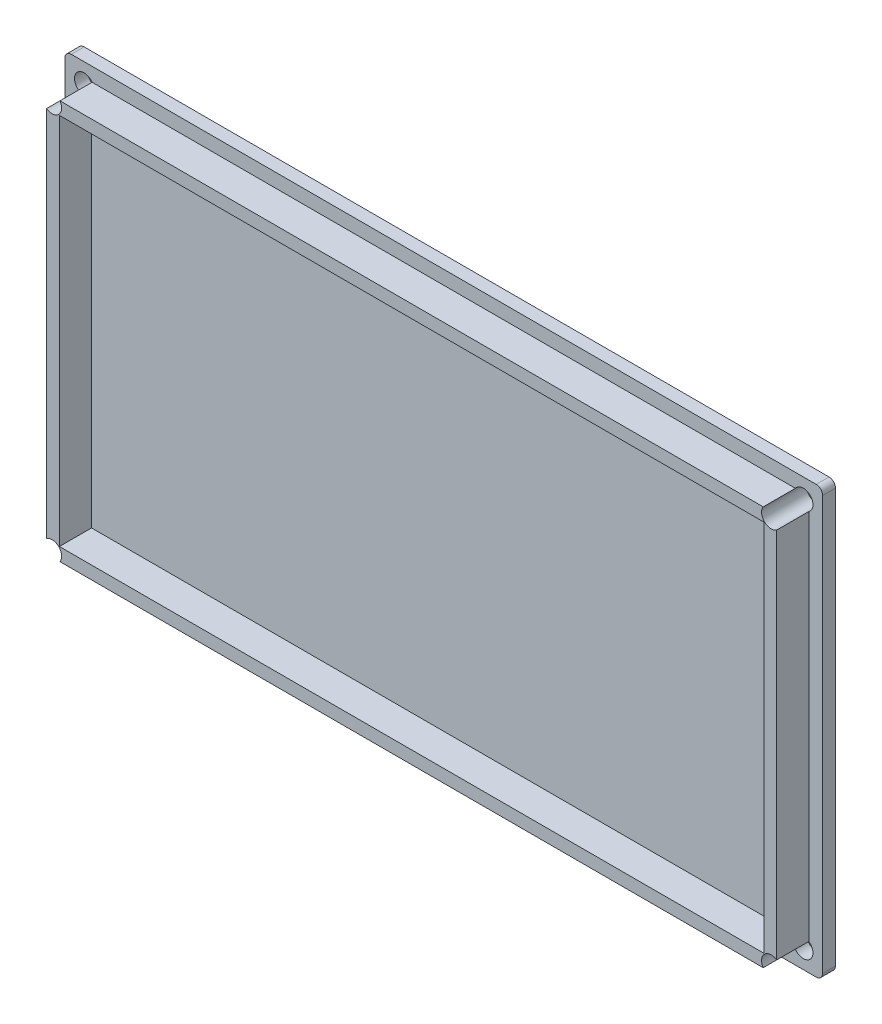
ISO-10303-21;
HEADER;
FILE_DESCRIPTION(('STEP AP214'),'2;1');
FILE_NAME('part.step','',(''),(''),'','','');
FILE_SCHEMA(('AUTOMOTIVE_DESIGN { 1 0 10303 214 1 1 1 1 }'));
ENDSEC;
DATA;
#1=APPLICATION_CONTEXT('core data for automotive mechanical design processes');
#2=APPLICATION_PROTOCOL_DEFINITION('international standard','automotive_design',2000,#1);
#3=PRODUCT_CONTEXT('',#1,'mechanical');
#4=PRODUCT('Part','Part','',(#3));
#5=PRODUCT_RELATED_PRODUCT_CATEGORY('part','',(#4));
#6=PRODUCT_DEFINITION_FORMATION('','',#4);
#7=PRODUCT_DEFINITION_CONTEXT('part definition',#1,'design');
#8=PRODUCT_DEFINITION('design','',#6,#7);
#9=PRODUCT_DEFINITION_SHAPE('','',#8);
#10=(LENGTH_UNIT() NAMED_UNIT(*) SI_UNIT(.MILLI.,.METRE.));
#11=(NAMED_UNIT(*) PLANE_ANGLE_UNIT() SI_UNIT($,.RADIAN.));
#12=(NAMED_UNIT(*) SI_UNIT($,.STERADIAN.) SOLID_ANGLE_UNIT());
#13=UNCERTAINTY_MEASURE_WITH_UNIT(LENGTH_MEASURE(1.E-05),#10,'distance_accuracy_value','');
#14=(GEOMETRIC_REPRESENTATION_CONTEXT(3) GLOBAL_UNCERTAINTY_ASSIGNED_CONTEXT((#13)) GLOBAL_UNIT_ASSIGNED_CONTEXT((#10,
#11,#12)) REPRESENTATION_CONTEXT('',''));
#15=CARTESIAN_POINT('',(0.,0.,0.));
#16=DIRECTION('',(0.,0.,1.));
#17=DIRECTION('',(1.,0.,0.));
#18=AXIS2_PLACEMENT_3D('',#15,#16,#17);
#19=CARTESIAN_POINT('',(60.052066251637,31.05,7.));
#20=DIRECTION('',(0.,-1.,0.));
#21=DIRECTION('',(0.,0.,-1.));
#22=AXIS2_PLACEMENT_3D('',#19,#20,#21);
#23=PLANE('',#22);
#24=DIRECTION('',(0.,0.,-1.));
#25=VECTOR('',#24,1.);
#26=CARTESIAN_POINT('',(-51.4620130389321,31.05,7.));
#27=LINE('',#26,#25);
#28=CARTESIAN_POINT('',(-51.4620130389321,31.05,7.));
#29=VERTEX_POINT('',#28);
#30=CARTESIAN_POINT('',(-51.4620130389321,31.05,2.));
#31=VERTEX_POINT('',#30);
#32=EDGE_CURVE('E416',#29,#31,#27,.T.);
#33=ORIENTED_EDGE('',*,*,#32,.F.);
#34=DIRECTION('',(-1.,0.,0.));
#35=VECTOR('',#34,1.);
#36=CARTESIAN_POINT('',(60.052066251637,31.05,7.));
#37=LINE('',#36,#35);
#38=CARTESIAN_POINT('',(57.9661455422062,31.05,7.));
#39=VERTEX_POINT('',#38);
#40=EDGE_CURVE('E214',#39,#29,#37,.T.);
#41=ORIENTED_EDGE('',*,*,#40,.F.);
#42=DIRECTION('',(0.,0.,-1.));
#43=VECTOR('',#42,1.);
#44=CARTESIAN_POINT('',(57.9661455422062,31.05,7.));
#45=LINE('',#44,#43);
#46=CARTESIAN_POINT('',(57.9661455422062,31.05,2.));
#47=VERTEX_POINT('',#46);
#48=EDGE_CURVE('E253',#39,#47,#45,.T.);
#49=ORIENTED_EDGE('',*,*,#48,.T.);
#50=DIRECTION('',(-1.,0.,0.));
#51=VECTOR('',#50,1.);
#52=CARTESIAN_POINT('',(60.052066251637,31.05,2.));
#53=LINE('',#52,#51);
#54=EDGE_CURVE('E232',#47,#31,#53,.T.);
#55=ORIENTED_EDGE('',*,*,#54,.T.);
#56=EDGE_LOOP('',(#33,#41,#49,#55));
#57=FACE_BOUND('',#56,.T.);
#58=ADVANCED_FACE('F45',(#57),#23,.F.);
#59=CARTESIAN_POINT('',(-53.547933748363,31.05,7.));
#60=DIRECTION('',(1.,0.,0.));
#61=DIRECTION('',(0.,0.,-1.));
#62=AXIS2_PLACEMENT_3D('',#59,#60,#61);
#63=PLANE('',#62);
#64=DIRECTION('',(0.,-1.,0.));
#65=VECTOR('',#64,1.);
#66=CARTESIAN_POINT('',(-53.547933748363,31.05,2.));
#67=LINE('',#66,#65);
#68=CARTESIAN_POINT('',(-53.547933748363,28.9640792905692,2.));
#69=VERTEX_POINT('',#68);
#70=CARTESIAN_POINT('',(-53.547933748363,-28.9640792905692,2.));
#71=VERTEX_POINT('',#70);
#72=EDGE_CURVE('E204',#69,#71,#67,.T.);
#73=ORIENTED_EDGE('',*,*,#72,.T.);
#74=DIRECTION('',(0.,0.,-1.));
#75=VECTOR('',#74,1.);
#76=CARTESIAN_POINT('',(-53.547933748363,-28.9640792905692,7.));
#77=LINE('',#76,#75);
#78=CARTESIAN_POINT('',(-53.547933748363,-28.9640792905692,7.));
#79=VERTEX_POINT('',#78);
#80=EDGE_CURVE('E186',#71,#79,#77,.F.);
#81=ORIENTED_EDGE('',*,*,#80,.T.);
#82=DIRECTION('',(0.,-1.,0.));
#83=VECTOR('',#82,1.);
#84=CARTESIAN_POINT('',(-53.547933748363,31.05,7.));
#85=LINE('',#84,#83);
#86=CARTESIAN_POINT('',(-53.547933748363,28.9640792905692,7.));
#87=VERTEX_POINT('',#86);
#88=EDGE_CURVE('E202',#87,#79,#85,.T.);
#89=ORIENTED_EDGE('',*,*,#88,.F.);
#90=DIRECTION('',(0.,0.,-1.));
#91=VECTOR('',#90,1.);
#92=CARTESIAN_POINT('',(-53.547933748363,28.9640792905692,7.));
#93=LINE('',#92,#91);
#94=EDGE_CURVE('E195',#69,#87,#93,.F.);
#95=ORIENTED_EDGE('',*,*,#94,.F.);
#96=EDGE_LOOP('',(#73,#81,#89,#95));
#97=FACE_BOUND('',#96,.T.);
#98=ADVANCED_FACE('F200',(#97),#63,.F.);
#99=CARTESIAN_POINT('',(-53.547933748363,-31.05,7.));
#100=DIRECTION('',(0.,1.,0.));
#101=DIRECTION('',(0.,0.,1.));
#102=AXIS2_PLACEMENT_3D('',#99,#100,#101);
#103=PLANE('',#102);
#104=DIRECTION('',(1.,0.,0.));
#105=VECTOR('',#104,1.);
#106=CARTESIAN_POINT('',(-53.547933748363,-31.05,7.));
#107=LINE('',#106,#105);
#108=CARTESIAN_POINT('',(-51.4620130389321,-31.05,7.));
#109=VERTEX_POINT('',#108);
#110=CARTESIAN_POINT('',(57.9661455422062,-31.05,7.));
#111=VERTEX_POINT('',#110);
#112=EDGE_CURVE('E238',#109,#111,#107,.T.);
#113=ORIENTED_EDGE('',*,*,#112,.F.);
#114=DIRECTION('',(0.,0.,-1.));
#115=VECTOR('',#114,1.);
#116=CARTESIAN_POINT('',(-51.4620130389321,-31.05,7.));
#117=LINE('',#116,#115);
#118=CARTESIAN_POINT('',(-51.4620130389321,-31.05,2.));
#119=VERTEX_POINT('',#118);
#120=EDGE_CURVE('E189',#109,#119,#117,.T.);
#121=ORIENTED_EDGE('',*,*,#120,.T.);
#122=DIRECTION('',(1.,0.,0.));
#123=VECTOR('',#122,1.);
#124=CARTESIAN_POINT('',(-53.547933748363,-31.05,2.));
#125=LINE('',#124,#123);
#126=CARTESIAN_POINT('',(57.9661455422062,-31.05,2.));
#127=VERTEX_POINT('',#126);
#128=EDGE_CURVE('E225',#119,#127,#125,.T.);
#129=ORIENTED_EDGE('',*,*,#128,.T.);
#130=DIRECTION('',(0.,0.,-1.));
#131=VECTOR('',#130,1.);
#132=CARTESIAN_POINT('',(57.9661455422062,-31.05,7.));
#133=LINE('',#132,#131);
#134=EDGE_CURVE('E430',#111,#127,#133,.T.);
#135=ORIENTED_EDGE('',*,*,#134,.F.);
#136=EDGE_LOOP('',(#113,#121,#129,#135));
#137=FACE_BOUND('',#136,.T.);
#138=ADVANCED_FACE('F363',(#137),#103,.F.);
#139=CARTESIAN_POINT('',(60.052066251637,-31.05,7.));
#140=DIRECTION('',(-1.,0.,0.));
#141=DIRECTION('',(0.,0.,1.));
#142=AXIS2_PLACEMENT_3D('',#139,#140,#141);
#143=PLANE('',#142);
#144=DIRECTION('',(0.,0.,-1.));
#145=VECTOR('',#144,1.);
#146=CARTESIAN_POINT('',(60.052066251637,-28.9640792905692,7.));
#147=LINE('',#146,#145);
#148=CARTESIAN_POINT('',(60.052066251637,-28.9640792905692,2.));
#149=VERTEX_POINT('',#148);
#150=CARTESIAN_POINT('',(60.052066251637,-28.9640792905692,7.));
#151=VERTEX_POINT('',#150);
#152=EDGE_CURVE('E267',#149,#151,#147,.F.);
#153=ORIENTED_EDGE('',*,*,#152,.F.);
#154=DIRECTION('',(0.,1.,0.));
#155=VECTOR('',#154,1.);
#156=CARTESIAN_POINT('',(60.052066251637,-31.05,2.));
#157=LINE('',#156,#155);
#158=CARTESIAN_POINT('',(60.052066251637,28.9640792905692,2.));
#159=VERTEX_POINT('',#158);
#160=EDGE_CURVE('E228',#149,#159,#157,.T.);
#161=ORIENTED_EDGE('',*,*,#160,.T.);
#162=DIRECTION('',(0.,0.,-1.));
#163=VECTOR('',#162,1.);
#164=CARTESIAN_POINT('',(60.052066251637,28.9640792905692,7.));
#165=LINE('',#164,#163);
#166=CARTESIAN_POINT('',(60.052066251637,28.9640792905692,7.));
#167=VERTEX_POINT('',#166);
#168=EDGE_CURVE('E445',#159,#167,#165,.F.);
#169=ORIENTED_EDGE('',*,*,#168,.T.);
#170=DIRECTION('',(0.,1.,0.));
#171=VECTOR('',#170,1.);
#172=CARTESIAN_POINT('',(60.052066251637,-31.05,7.));
#173=LINE('',#172,#171);
#174=EDGE_CURVE('E221',#151,#167,#173,.T.);
#175=ORIENTED_EDGE('',*,*,#174,.F.);
#176=EDGE_LOOP('',(#153,#161,#169,#175));
#177=FACE_BOUND('',#176,.T.);
#178=ADVANCED_FACE('F368',(#177),#143,.F.);
#179=CARTESIAN_POINT('',(0.,0.,2.));
#180=DIRECTION('',(0.,0.,1.));
#181=DIRECTION('',(1.,0.,0.));
#182=AXIS2_PLACEMENT_3D('',#179,#180,#181);
#183=PLANE('',#182);
#184=CARTESIAN_POINT('',(-52.697933748363,-30.2,2.));
#185=DIRECTION('',(0.,0.,1.));
#186=DIRECTION('',(1.,0.,0.));
#187=AXIS2_PLACEMENT_3D('',#184,#185,#186);
#188=CIRCLE('',#187,1.5);
#189=EDGE_CURVE('E399',#71,#119,#188,.T.);
#190=ORIENTED_EDGE('',*,*,#189,.F.);
#191=ORIENTED_EDGE('',*,*,#72,.F.);
#192=CARTESIAN_POINT('',(-52.697933748363,30.2,2.));
#193=DIRECTION('',(0.,0.,1.));
#194=DIRECTION('',(1.,0.,0.));
#195=AXIS2_PLACEMENT_3D('',#192,#193,#194);
#196=CIRCLE('',#195,1.5);
#197=EDGE_CURVE('E413',#69,#31,#196,.F.);
#198=ORIENTED_EDGE('',*,*,#197,.T.);
#199=ORIENTED_EDGE('',*,*,#54,.F.);
#200=CARTESIAN_POINT('',(59.202066251637,30.2,2.));
#201=DIRECTION('',(0.,0.,1.));
#202=DIRECTION('',(1.,0.,0.));
#203=AXIS2_PLACEMENT_3D('',#200,#201,#202);
#204=CIRCLE('',#203,1.5);
#205=EDGE_CURVE('E442',#159,#47,#204,.T.);
#206=ORIENTED_EDGE('',*,*,#205,.F.);
#207=ORIENTED_EDGE('',*,*,#160,.F.);
#208=CARTESIAN_POINT('',(59.202066251637,-30.2,2.));
#209=DIRECTION('',(0.,0.,1.));
#210=DIRECTION('',(1.,0.,0.));
#211=AXIS2_PLACEMENT_3D('',#208,#209,#210);
#212=CIRCLE('',#211,1.5);
#213=EDGE_CURVE('E427',#149,#127,#212,.F.);
#214=ORIENTED_EDGE('',*,*,#213,.T.);
#215=ORIENTED_EDGE('',*,*,#128,.F.);
#216=EDGE_LOOP('',(#190,#191,#198,#199,#206,#207,#214,#215));
#217=FACE_BOUND('',#216,.T.);
#218=DIRECTION('',(1.,0.,0.));
#219=VECTOR('',#218,1.);
#220=CARTESIAN_POINT('',(-55.697933748363,-33.2,2.));
#221=LINE('',#220,#219);
#222=CARTESIAN_POINT('',(-54.697933748363,-33.2,2.));
#223=VERTEX_POINT('',#222);
#224=CARTESIAN_POINT('',(61.202066251637,-33.2,2.));
#225=VERTEX_POINT('',#224);
#226=EDGE_CURVE('E250',#223,#225,#221,.T.);
#227=ORIENTED_EDGE('',*,*,#226,.T.);
#228=CARTESIAN_POINT('',(61.202066251637,-32.2,2.));
#229=DIRECTION('',(0.,0.,1.));
#230=DIRECTION('',(1.,0.,0.));
#231=AXIS2_PLACEMENT_3D('',#228,#229,#230);
#232=CIRCLE('',#231,1.);
#233=CARTESIAN_POINT('',(62.202066251637,-32.2,2.));
#234=VERTEX_POINT('',#233);
#235=EDGE_CURVE('E305',#225,#234,#232,.T.);
#236=ORIENTED_EDGE('',*,*,#235,.T.);
#237=DIRECTION('',(0.,1.,0.));
#238=VECTOR('',#237,1.);
#239=CARTESIAN_POINT('',(62.202066251637,33.2,2.));
#240=LINE('',#239,#238);
#241=CARTESIAN_POINT('',(62.202066251637,32.2,2.));
#242=VERTEX_POINT('',#241);
#243=EDGE_CURVE('E239',#234,#242,#240,.T.);
#244=ORIENTED_EDGE('',*,*,#243,.T.);
#245=CARTESIAN_POINT('',(61.202066251637,32.2,2.));
#246=DIRECTION('',(0.,0.,1.));
#247=DIRECTION('',(1.,0.,0.));
#248=AXIS2_PLACEMENT_3D('',#245,#246,#247);
#249=CIRCLE('',#248,1.);
#250=CARTESIAN_POINT('',(61.202066251637,33.2,2.));
#251=VERTEX_POINT('',#250);
#252=EDGE_CURVE('E302',#242,#251,#249,.T.);
#253=ORIENTED_EDGE('',*,*,#252,.T.);
#254=DIRECTION('',(-1.,0.,0.));
#255=VECTOR('',#254,1.);
#256=CARTESIAN_POINT('',(-55.697933748363,33.2,2.));
#257=LINE('',#256,#255);
#258=CARTESIAN_POINT('',(-54.697933748363,33.2,2.));
#259=VERTEX_POINT('',#258);
#260=EDGE_CURVE('E243',#251,#259,#257,.T.);
#261=ORIENTED_EDGE('',*,*,#260,.T.);
#262=CARTESIAN_POINT('',(-54.697933748363,32.2,2.));
#263=DIRECTION('',(0.,0.,1.));
#264=DIRECTION('',(1.,0.,0.));
#265=AXIS2_PLACEMENT_3D('',#262,#263,#264);
#266=CIRCLE('',#265,1.);
#267=CARTESIAN_POINT('',(-55.697933748363,32.2,2.));
#268=VERTEX_POINT('',#267);
#269=EDGE_CURVE('E67',#259,#268,#266,.T.);
#270=ORIENTED_EDGE('',*,*,#269,.T.);
#271=DIRECTION('',(0.,-1.,0.));
#272=VECTOR('',#271,1.);
#273=CARTESIAN_POINT('',(-55.697933748363,33.2,2.));
#274=LINE('',#273,#272);
#275=CARTESIAN_POINT('',(-55.697933748363,-32.2,2.));
#276=VERTEX_POINT('',#275);
#277=EDGE_CURVE('E247',#268,#276,#274,.T.);
#278=ORIENTED_EDGE('',*,*,#277,.T.);
#279=CARTESIAN_POINT('',(-54.697933748363,-32.2,2.));
#280=DIRECTION('',(0.,0.,1.));
#281=DIRECTION('',(1.,0.,0.));
#282=AXIS2_PLACEMENT_3D('',#279,#280,#281);
#283=CIRCLE('',#282,1.);
#284=EDGE_CURVE('E297',#276,#223,#283,.T.);
#285=ORIENTED_EDGE('',*,*,#284,.T.);
#286=EDGE_LOOP('',(#227,#236,#244,#253,#261,#270,#278,#285));
#287=FACE_BOUND('',#286,.T.);
#288=ADVANCED_FACE('F332',(#217,#287),#183,.T.);
#289=CARTESIAN_POINT('',(62.202066251637,33.2,2.));
#290=DIRECTION('',(-1.,0.,0.));
#291=DIRECTION('',(0.,-1.,0.));
#292=AXIS2_PLACEMENT_3D('',#289,#290,#291);
#293=PLANE('',#292);
#294=ORIENTED_EDGE('',*,*,#243,.F.);
#295=DIRECTION('',(0.,0.,-1.));
#296=VECTOR('',#295,1.);
#297=CARTESIAN_POINT('',(62.202066251637,-32.2,2.));
#298=LINE('',#297,#296);
#299=CARTESIAN_POINT('',(62.202066251637,-32.2,0.));
#300=VERTEX_POINT('',#299);
#301=EDGE_CURVE('E274',#234,#300,#298,.T.);
#302=ORIENTED_EDGE('',*,*,#301,.T.);
#303=DIRECTION('',(0.,1.,0.));
#304=VECTOR('',#303,1.);
#305=CARTESIAN_POINT('',(62.202066251637,33.2,0.));
#306=LINE('',#305,#304);
#307=CARTESIAN_POINT('',(62.202066251637,32.2,0.));
#308=VERTEX_POINT('',#307);
#309=EDGE_CURVE('E213',#300,#308,#306,.T.);
#310=ORIENTED_EDGE('',*,*,#309,.T.);
#311=DIRECTION('',(0.,0.,-1.));
#312=VECTOR('',#311,1.);
#313=CARTESIAN_POINT('',(62.202066251637,32.2,2.));
#314=LINE('',#313,#312);
#315=EDGE_CURVE('E194',#308,#242,#314,.F.);
#316=ORIENTED_EDGE('',*,*,#315,.T.);
#317=EDGE_LOOP('',(#294,#302,#310,#316));
#318=FACE_BOUND('',#317,.T.);
#319=ADVANCED_FACE('F346',(#318),#293,.F.);
#320=CARTESIAN_POINT('',(-55.697933748363,33.2,2.));
#321=DIRECTION('',(0.,-1.,0.));
#322=DIRECTION('',(0.,0.,-1.));
#323=AXIS2_PLACEMENT_3D('',#320,#321,#322);
#324=PLANE('',#323);
#325=ORIENTED_EDGE('',*,*,#260,.F.);
#326=DIRECTION('',(0.,0.,-1.));
#327=VECTOR('',#326,1.);
#328=CARTESIAN_POINT('',(61.202066251637,33.2,2.));
#329=LINE('',#328,#327);
#330=CARTESIAN_POINT('',(61.202066251637,33.2,0.));
#331=VERTEX_POINT('',#330);
#332=EDGE_CURVE('E311',#251,#331,#329,.T.);
#333=ORIENTED_EDGE('',*,*,#332,.T.);
#334=DIRECTION('',(-1.,0.,0.));
#335=VECTOR('',#334,1.);
#336=CARTESIAN_POINT('',(-55.697933748363,33.2,0.));
#337=LINE('',#336,#335);
#338=CARTESIAN_POINT('',(-54.697933748363,33.2,0.));
#339=VERTEX_POINT('',#338);
#340=EDGE_CURVE('E219',#331,#339,#337,.T.);
#341=ORIENTED_EDGE('',*,*,#340,.T.);
#342=DIRECTION('',(0.,0.,-1.));
#343=VECTOR('',#342,1.);
#344=CARTESIAN_POINT('',(-54.697933748363,33.2,2.));
#345=LINE('',#344,#343);
#346=EDGE_CURVE('E308',#339,#259,#345,.F.);
#347=ORIENTED_EDGE('',*,*,#346,.T.);
#348=EDGE_LOOP('',(#325,#333,#341,#347));
#349=FACE_BOUND('',#348,.T.);
#350=ADVANCED_FACE('F319',(#349),#324,.F.);
#351=CARTESIAN_POINT('',(-55.697933748363,33.2,2.));
#352=DIRECTION('',(1.,0.,0.));
#353=DIRECTION('',(0.,0.,-1.));
#354=AXIS2_PLACEMENT_3D('',#351,#352,#353);
#355=PLANE('',#354);
#356=ORIENTED_EDGE('',*,*,#277,.F.);
#357=DIRECTION('',(0.,0.,-1.));
#358=VECTOR('',#357,1.);
#359=CARTESIAN_POINT('',(-55.697933748363,32.2,2.));
#360=LINE('',#359,#358);
#361=CARTESIAN_POINT('',(-55.697933748363,32.2,0.));
#362=VERTEX_POINT('',#361);
#363=EDGE_CURVE('E11',#268,#362,#360,.T.);
#364=ORIENTED_EDGE('',*,*,#363,.T.);
#365=DIRECTION('',(0.,-1.,0.));
#366=VECTOR('',#365,1.);
#367=CARTESIAN_POINT('',(-55.697933748363,33.2,0.));
#368=LINE('',#367,#366);
#369=CARTESIAN_POINT('',(-55.697933748363,-32.2,0.));
#370=VERTEX_POINT('',#369);
#371=EDGE_CURVE('E258',#362,#370,#368,.T.);
#372=ORIENTED_EDGE('',*,*,#371,.T.);
#373=DIRECTION('',(0.,0.,-1.));
#374=VECTOR('',#373,1.);
#375=CARTESIAN_POINT('',(-55.697933748363,-32.2,2.));
#376=LINE('',#375,#374);
#377=EDGE_CURVE('E54',#370,#276,#376,.F.);
#378=ORIENTED_EDGE('',*,*,#377,.T.);
#379=EDGE_LOOP('',(#356,#364,#372,#378));
#380=FACE_BOUND('',#379,.T.);
#381=ADVANCED_FACE('F330',(#380),#355,.F.);
#382=CARTESIAN_POINT('',(-55.697933748363,-33.2,2.));
#383=DIRECTION('',(0.,1.,0.));
#384=DIRECTION('',(0.,0.,1.));
#385=AXIS2_PLACEMENT_3D('',#382,#383,#384);
#386=PLANE('',#385);
#387=DIRECTION('',(1.,0.,0.));
#388=VECTOR('',#387,1.);
#389=CARTESIAN_POINT('',(-55.697933748363,-33.2,0.));
#390=LINE('',#389,#388);
#391=CARTESIAN_POINT('',(-54.697933748363,-33.2,0.));
#392=VERTEX_POINT('',#391);
#393=CARTESIAN_POINT('',(61.202066251637,-33.2,0.));
#394=VERTEX_POINT('',#393);
#395=EDGE_CURVE('E244',#392,#394,#390,.T.);
#396=ORIENTED_EDGE('',*,*,#395,.T.);
#397=DIRECTION('',(0.,0.,-1.));
#398=VECTOR('',#397,1.);
#399=CARTESIAN_POINT('',(61.202066251637,-33.2,2.));
#400=LINE('',#399,#398);
#401=EDGE_CURVE('E294',#394,#225,#400,.F.);
#402=ORIENTED_EDGE('',*,*,#401,.T.);
#403=ORIENTED_EDGE('',*,*,#226,.F.);
#404=DIRECTION('',(0.,0.,-1.));
#405=VECTOR('',#404,1.);
#406=CARTESIAN_POINT('',(-54.697933748363,-33.2,2.));
#407=LINE('',#406,#405);
#408=EDGE_CURVE('E290',#223,#392,#407,.T.);
#409=ORIENTED_EDGE('',*,*,#408,.T.);
#410=EDGE_LOOP('',(#396,#402,#403,#409));
#411=FACE_BOUND('',#410,.T.);
#412=ADVANCED_FACE('F338',(#411),#386,.F.);
#413=CARTESIAN_POINT('',(0.,0.,0.));
#414=DIRECTION('',(0.,0.,1.));
#415=DIRECTION('',(1.,0.,0.));
#416=AXIS2_PLACEMENT_3D('',#413,#414,#415);
#417=PLANE('',#416);
#418=CARTESIAN_POINT('',(-52.697933748363,-30.2,0.));
#419=DIRECTION('',(0.,0.,1.));
#420=DIRECTION('',(1.,0.,0.));
#421=AXIS2_PLACEMENT_3D('',#418,#419,#420);
#422=CIRCLE('',#421,1.5);
#423=CARTESIAN_POINT('',(-51.197933748363,-30.2,0.));
#424=VERTEX_POINT('',#423);
#425=EDGE_CURVE('E403',#424,#424,#422,.T.);
#426=ORIENTED_EDGE('',*,*,#425,.T.);
#427=EDGE_LOOP('',(#426));
#428=FACE_BOUND('',#427,.T.);
#429=CARTESIAN_POINT('',(-52.697933748363,30.2,0.));
#430=DIRECTION('',(0.,0.,1.));
#431=DIRECTION('',(1.,0.,0.));
#432=AXIS2_PLACEMENT_3D('',#429,#430,#431);
#433=CIRCLE('',#432,1.5);
#434=CARTESIAN_POINT('',(-51.197933748363,30.2,0.));
#435=VERTEX_POINT('',#434);
#436=EDGE_CURVE('E419',#435,#435,#433,.F.);
#437=ORIENTED_EDGE('',*,*,#436,.F.);
#438=EDGE_LOOP('',(#437));
#439=FACE_BOUND('',#438,.T.);
#440=CARTESIAN_POINT('',(59.202066251637,-30.2,0.));
#441=DIRECTION('',(0.,0.,1.));
#442=DIRECTION('',(1.,0.,0.));
#443=AXIS2_PLACEMENT_3D('',#440,#441,#442);
#444=CIRCLE('',#443,1.5);
#445=CARTESIAN_POINT('',(60.702066251637,-30.2,0.));
#446=VERTEX_POINT('',#445);
#447=EDGE_CURVE('E434',#446,#446,#444,.F.);
#448=ORIENTED_EDGE('',*,*,#447,.F.);
#449=EDGE_LOOP('',(#448));
#450=FACE_BOUND('',#449,.T.);
#451=CARTESIAN_POINT('',(59.202066251637,30.2,0.));
#452=DIRECTION('',(0.,0.,1.));
#453=DIRECTION('',(1.,0.,0.));
#454=AXIS2_PLACEMENT_3D('',#451,#452,#453);
#455=CIRCLE('',#454,1.5);
#456=CARTESIAN_POINT('',(60.702066251637,30.2,0.));
#457=VERTEX_POINT('',#456);
#458=EDGE_CURVE('E449',#457,#457,#455,.T.);
#459=ORIENTED_EDGE('',*,*,#458,.T.);
#460=EDGE_LOOP('',(#459));
#461=FACE_BOUND('',#460,.T.);
#462=ORIENTED_EDGE('',*,*,#309,.F.);
#463=CARTESIAN_POINT('',(61.202066251637,-32.2,0.));
#464=DIRECTION('',(0.,0.,1.));
#465=DIRECTION('',(1.,0.,0.));
#466=AXIS2_PLACEMENT_3D('',#463,#464,#465);
#467=CIRCLE('',#466,1.);
#468=EDGE_CURVE('E287',#300,#394,#467,.F.);
#469=ORIENTED_EDGE('',*,*,#468,.T.);
#470=ORIENTED_EDGE('',*,*,#395,.F.);
#471=CARTESIAN_POINT('',(-54.697933748363,-32.2,0.));
#472=DIRECTION('',(0.,0.,1.));
#473=DIRECTION('',(1.,0.,0.));
#474=AXIS2_PLACEMENT_3D('',#471,#472,#473);
#475=CIRCLE('',#474,1.);
#476=EDGE_CURVE('E278',#392,#370,#475,.F.);
#477=ORIENTED_EDGE('',*,*,#476,.T.);
#478=ORIENTED_EDGE('',*,*,#371,.F.);
#479=CARTESIAN_POINT('',(-54.697933748363,32.2,0.));
#480=DIRECTION('',(0.,0.,1.));
#481=DIRECTION('',(1.,0.,0.));
#482=AXIS2_PLACEMENT_3D('',#479,#480,#481);
#483=CIRCLE('',#482,1.);
#484=EDGE_CURVE('E281',#362,#339,#483,.F.);
#485=ORIENTED_EDGE('',*,*,#484,.T.);
#486=ORIENTED_EDGE('',*,*,#340,.F.);
#487=CARTESIAN_POINT('',(61.202066251637,32.2,0.));
#488=DIRECTION('',(0.,0.,1.));
#489=DIRECTION('',(1.,0.,0.));
#490=AXIS2_PLACEMENT_3D('',#487,#488,#489);
#491=CIRCLE('',#490,1.);
#492=EDGE_CURVE('E284',#331,#308,#491,.F.);
#493=ORIENTED_EDGE('',*,*,#492,.T.);
#494=EDGE_LOOP('',(#462,#469,#470,#477,#478,#485,#486,#493));
#495=FACE_BOUND('',#494,.T.);
#496=ADVANCED_FACE('F325',(#428,#439,#450,#461,#495),#417,.F.);
#497=CARTESIAN_POINT('',(0.,0.,7.));
#498=DIRECTION('',(0.,0.,1.));
#499=DIRECTION('',(1.,0.,0.));
#500=AXIS2_PLACEMENT_3D('',#497,#498,#499);
#501=PLANE('',#500);
#502=CARTESIAN_POINT('',(-52.697933748363,-30.2,7.));
#503=DIRECTION('',(0.,0.,1.));
#504=DIRECTION('',(1.,0.,0.));
#505=AXIS2_PLACEMENT_3D('',#502,#503,#504);
#506=CIRCLE('',#505,1.5);
#507=EDGE_CURVE('E183',#109,#79,#506,.T.);
#508=ORIENTED_EDGE('',*,*,#507,.F.);
#509=ORIENTED_EDGE('',*,*,#112,.T.);
#510=CARTESIAN_POINT('',(59.202066251637,-30.2,7.));
#511=DIRECTION('',(0.,0.,1.));
#512=DIRECTION('',(-1.,0.,0.));
#513=AXIS2_PLACEMENT_3D('',#510,#511,#512);
#514=CIRCLE('',#513,1.5);
#515=EDGE_CURVE('E423',#151,#111,#514,.T.);
#516=ORIENTED_EDGE('',*,*,#515,.F.);
#517=ORIENTED_EDGE('',*,*,#174,.T.);
#518=CARTESIAN_POINT('',(59.202066251637,30.2,7.));
#519=DIRECTION('',(0.,0.,-1.));
#520=DIRECTION('',(-1.,0.,0.));
#521=AXIS2_PLACEMENT_3D('',#518,#519,#520);
#522=CIRCLE('',#521,1.5);
#523=EDGE_CURVE('E438',#167,#39,#522,.T.);
#524=ORIENTED_EDGE('',*,*,#523,.T.);
#525=ORIENTED_EDGE('',*,*,#40,.T.);
#526=CARTESIAN_POINT('',(-52.697933748363,30.2,7.));
#527=DIRECTION('',(0.,0.,1.));
#528=DIRECTION('',(1.,0.,0.));
#529=AXIS2_PLACEMENT_3D('',#526,#527,#528);
#530=CIRCLE('',#529,1.5);
#531=EDGE_CURVE('E206',#87,#29,#530,.T.);
#532=ORIENTED_EDGE('',*,*,#531,.F.);
#533=ORIENTED_EDGE('',*,*,#88,.T.);
#534=EDGE_LOOP('',(#508,#509,#516,#517,#524,#525,#532,#533));
#535=FACE_BOUND('',#534,.T.);
#536=DIRECTION('',(0.,1.,0.));
#537=VECTOR('',#536,1.);
#538=CARTESIAN_POINT('',(58.052066251637,-29.05,7.));
#539=LINE('',#538,#537);
#540=CARTESIAN_POINT('',(58.052066251637,-29.05,7.));
#541=VERTEX_POINT('',#540);
#542=CARTESIAN_POINT('',(58.052066251637,29.05,7.));
#543=VERTEX_POINT('',#542);
#544=EDGE_CURVE('E457',#541,#543,#539,.T.);
#545=ORIENTED_EDGE('',*,*,#544,.F.);
#546=DIRECTION('',(1.,0.,0.));
#547=VECTOR('',#546,1.);
#548=CARTESIAN_POINT('',(-51.547933748363,-29.05,7.));
#549=LINE('',#548,#547);
#550=CARTESIAN_POINT('',(-51.547933748363,-29.05,7.));
#551=VERTEX_POINT('',#550);
#552=EDGE_CURVE('E454',#551,#541,#549,.T.);
#553=ORIENTED_EDGE('',*,*,#552,.F.);
#554=DIRECTION('',(0.,-1.,0.));
#555=VECTOR('',#554,1.);
#556=CARTESIAN_POINT('',(-51.547933748363,29.05,7.));
#557=LINE('',#556,#555);
#558=CARTESIAN_POINT('',(-51.547933748363,29.05,7.));
#559=VERTEX_POINT('',#558);
#560=EDGE_CURVE('E465',#559,#551,#557,.T.);
#561=ORIENTED_EDGE('',*,*,#560,.F.);
#562=DIRECTION('',(-1.,0.,0.));
#563=VECTOR('',#562,1.);
#564=CARTESIAN_POINT('',(58.052066251637,29.05,7.));
#565=LINE('',#564,#563);
#566=EDGE_CURVE('E461',#543,#559,#565,.T.);
#567=ORIENTED_EDGE('',*,*,#566,.F.);
#568=EDGE_LOOP('',(#545,#553,#561,#567));
#569=FACE_BOUND('',#568,.T.);
#570=ADVANCED_FACE('F209',(#535,#569),#501,.T.);
#571=CARTESIAN_POINT('',(-51.547933748363,-29.05,7.));
#572=DIRECTION('',(0.,1.,0.));
#573=DIRECTION('',(0.,0.,1.));
#574=AXIS2_PLACEMENT_3D('',#571,#572,#573);
#575=PLANE('',#574);
#576=DIRECTION('',(1.,0.,0.));
#577=VECTOR('',#576,1.);
#578=CARTESIAN_POINT('',(-51.547933748363,-29.05,2.));
#579=LINE('',#578,#577);
#580=CARTESIAN_POINT('',(-51.547933748363,-29.05,2.));
#581=VERTEX_POINT('',#580);
#582=CARTESIAN_POINT('',(58.052066251637,-29.05,2.));
#583=VERTEX_POINT('',#582);
#584=EDGE_CURVE('E453',#581,#583,#579,.T.);
#585=ORIENTED_EDGE('',*,*,#584,.F.);
#586=DIRECTION('',(0.,0.,-1.));
#587=VECTOR('',#586,1.);
#588=CARTESIAN_POINT('',(-51.547933748363,-29.05,7.));
#589=LINE('',#588,#587);
#590=EDGE_CURVE('E468',#551,#581,#589,.T.);
#591=ORIENTED_EDGE('',*,*,#590,.F.);
#592=ORIENTED_EDGE('',*,*,#552,.T.);
#593=DIRECTION('',(0.,0.,-1.));
#594=VECTOR('',#593,1.);
#595=CARTESIAN_POINT('',(58.052066251637,-29.05,7.));
#596=LINE('',#595,#594);
#597=EDGE_CURVE('E229',#541,#583,#596,.T.);
#598=ORIENTED_EDGE('',*,*,#597,.T.);
#599=EDGE_LOOP('',(#585,#591,#592,#598));
#600=FACE_BOUND('',#599,.T.);
#601=ADVANCED_FACE('F535',(#600),#575,.T.);
#602=CARTESIAN_POINT('',(58.052066251637,-29.05,7.));
#603=DIRECTION('',(-1.,0.,0.));
#604=DIRECTION('',(0.,0.,1.));
#605=AXIS2_PLACEMENT_3D('',#602,#603,#604);
#606=PLANE('',#605);
#607=DIRECTION('',(0.,1.,0.));
#608=VECTOR('',#607,1.);
#609=CARTESIAN_POINT('',(58.052066251637,-29.05,2.));
#610=LINE('',#609,#608);
#611=CARTESIAN_POINT('',(58.052066251637,29.05,2.));
#612=VERTEX_POINT('',#611);
#613=EDGE_CURVE('E471',#583,#612,#610,.T.);
#614=ORIENTED_EDGE('',*,*,#613,.F.);
#615=ORIENTED_EDGE('',*,*,#597,.F.);
#616=ORIENTED_EDGE('',*,*,#544,.T.);
#617=DIRECTION('',(0.,0.,-1.));
#618=VECTOR('',#617,1.);
#619=CARTESIAN_POINT('',(58.052066251637,29.05,7.));
#620=LINE('',#619,#618);
#621=EDGE_CURVE('E486',#543,#612,#620,.T.);
#622=ORIENTED_EDGE('',*,*,#621,.T.);
#623=EDGE_LOOP('',(#614,#615,#616,#622));
#624=FACE_BOUND('',#623,.T.);
#625=ADVANCED_FACE('F531',(#624),#606,.T.);
#626=CARTESIAN_POINT('',(58.052066251637,29.05,7.));
#627=DIRECTION('',(0.,-1.,0.));
#628=DIRECTION('',(0.,0.,-1.));
#629=AXIS2_PLACEMENT_3D('',#626,#627,#628);
#630=PLANE('',#629);
#631=DIRECTION('',(-1.,0.,0.));
#632=VECTOR('',#631,1.);
#633=CARTESIAN_POINT('',(58.052066251637,29.05,2.));
#634=LINE('',#633,#632);
#635=CARTESIAN_POINT('',(-51.547933748363,29.05,2.));
#636=VERTEX_POINT('',#635);
#637=EDGE_CURVE('E474',#612,#636,#634,.T.);
#638=ORIENTED_EDGE('',*,*,#637,.F.);
#639=ORIENTED_EDGE('',*,*,#621,.F.);
#640=ORIENTED_EDGE('',*,*,#566,.T.);
#641=DIRECTION('',(0.,0.,-1.));
#642=VECTOR('',#641,1.);
#643=CARTESIAN_POINT('',(-51.547933748363,29.05,7.));
#644=LINE('',#643,#642);
#645=EDGE_CURVE('E482',#559,#636,#644,.T.);
#646=ORIENTED_EDGE('',*,*,#645,.T.);
#647=EDGE_LOOP('',(#638,#639,#640,#646));
#648=FACE_BOUND('',#647,.T.);
#649=ADVANCED_FACE('F527',(#648),#630,.T.);
#650=CARTESIAN_POINT('',(-51.547933748363,29.05,7.));
#651=DIRECTION('',(1.,0.,0.));
#652=DIRECTION('',(0.,0.,-1.));
#653=AXIS2_PLACEMENT_3D('',#650,#651,#652);
#654=PLANE('',#653);
#655=DIRECTION('',(0.,-1.,0.));
#656=VECTOR('',#655,1.);
#657=CARTESIAN_POINT('',(-51.547933748363,29.05,2.));
#658=LINE('',#657,#656);
#659=EDGE_CURVE('E458',#636,#581,#658,.T.);
#660=ORIENTED_EDGE('',*,*,#659,.F.);
#661=ORIENTED_EDGE('',*,*,#645,.F.);
#662=ORIENTED_EDGE('',*,*,#560,.T.);
#663=ORIENTED_EDGE('',*,*,#590,.T.);
#664=EDGE_LOOP('',(#660,#661,#662,#663));
#665=FACE_BOUND('',#664,.T.);
#666=ADVANCED_FACE('F379',(#665),#654,.T.);
#667=ORIENTED_EDGE('',*,*,#584,.T.);
#668=ORIENTED_EDGE('',*,*,#613,.T.);
#669=ORIENTED_EDGE('',*,*,#637,.T.);
#670=ORIENTED_EDGE('',*,*,#659,.T.);
#671=EDGE_LOOP('',(#667,#668,#669,#670));
#672=FACE_BOUND('',#671,.T.);
#673=ADVANCED_FACE('F375',(#672),#183,.T.);
#674=CARTESIAN_POINT('',(59.202066251637,30.2,7.));
#675=DIRECTION('',(0.,0.,-1.));
#676=DIRECTION('',(-1.,0.,0.));
#677=AXIS2_PLACEMENT_3D('',#674,#675,#676);
#678=CYLINDRICAL_SURFACE('',#677,1.5);
#679=ORIENTED_EDGE('',*,*,#205,.T.);
#680=ORIENTED_EDGE('',*,*,#48,.F.);
#681=ORIENTED_EDGE('',*,*,#523,.F.);
#682=ORIENTED_EDGE('',*,*,#168,.F.);
#683=EDGE_LOOP('',(#679,#680,#681,#682));
#684=FACE_BOUND('',#683,.T.);
#685=ORIENTED_EDGE('',*,*,#458,.F.);
#686=EDGE_LOOP('',(#685));
#687=FACE_BOUND('',#686,.T.);
#688=ADVANCED_FACE('F378',(#684,#687),#678,.F.);
#689=CARTESIAN_POINT('',(59.202066251637,-30.2,7.));
#690=DIRECTION('',(0.,0.,-1.));
#691=DIRECTION('',(-1.,0.,0.));
#692=AXIS2_PLACEMENT_3D('',#689,#690,#691);
#693=CYLINDRICAL_SURFACE('',#692,1.5);
#694=ORIENTED_EDGE('',*,*,#134,.T.);
#695=ORIENTED_EDGE('',*,*,#213,.F.);
#696=ORIENTED_EDGE('',*,*,#152,.T.);
#697=ORIENTED_EDGE('',*,*,#515,.T.);
#698=EDGE_LOOP('',(#694,#695,#696,#697));
#699=FACE_BOUND('',#698,.T.);
#700=ORIENTED_EDGE('',*,*,#447,.T.);
#701=EDGE_LOOP('',(#700));
#702=FACE_BOUND('',#701,.T.);
#703=ADVANCED_FACE('F510',(#699,#702),#693,.F.);
#704=CARTESIAN_POINT('',(-52.697933748363,30.2,7.));
#705=DIRECTION('',(0.,0.,-1.));
#706=DIRECTION('',(-1.,0.,0.));
#707=AXIS2_PLACEMENT_3D('',#704,#705,#706);
#708=CYLINDRICAL_SURFACE('',#707,1.5);
#709=ORIENTED_EDGE('',*,*,#32,.T.);
#710=ORIENTED_EDGE('',*,*,#197,.F.);
#711=ORIENTED_EDGE('',*,*,#94,.T.);
#712=ORIENTED_EDGE('',*,*,#531,.T.);
#713=EDGE_LOOP('',(#709,#710,#711,#712));
#714=FACE_BOUND('',#713,.T.);
#715=ORIENTED_EDGE('',*,*,#436,.T.);
#716=EDGE_LOOP('',(#715));
#717=FACE_BOUND('',#716,.T.);
#718=ADVANCED_FACE('F507',(#714,#717),#708,.F.);
#719=CARTESIAN_POINT('',(-52.697933748363,-30.2,7.));
#720=DIRECTION('',(0.,0.,-1.));
#721=DIRECTION('',(-1.,0.,0.));
#722=AXIS2_PLACEMENT_3D('',#719,#720,#721);
#723=CYLINDRICAL_SURFACE('',#722,1.5);
#724=ORIENTED_EDGE('',*,*,#425,.F.);
#725=EDGE_LOOP('',(#724));
#726=FACE_BOUND('',#725,.T.);
#727=ORIENTED_EDGE('',*,*,#189,.T.);
#728=ORIENTED_EDGE('',*,*,#120,.F.);
#729=ORIENTED_EDGE('',*,*,#507,.T.);
#730=ORIENTED_EDGE('',*,*,#80,.F.);
#731=EDGE_LOOP('',(#727,#728,#729,#730));
#732=FACE_BOUND('',#731,.T.);
#733=ADVANCED_FACE('F185',(#726,#732),#723,.F.);
#734=CARTESIAN_POINT('',(61.202066251637,-32.2,2.));
#735=DIRECTION('',(0.,0.,-1.));
#736=DIRECTION('',(-1.,0.,0.));
#737=AXIS2_PLACEMENT_3D('',#734,#735,#736);
#738=CYLINDRICAL_SURFACE('',#737,1.);
#739=ORIENTED_EDGE('',*,*,#235,.F.);
#740=ORIENTED_EDGE('',*,*,#401,.F.);
#741=ORIENTED_EDGE('',*,*,#468,.F.);
#742=ORIENTED_EDGE('',*,*,#301,.F.);
#743=EDGE_LOOP('',(#739,#740,#741,#742));
#744=FACE_BOUND('',#743,.T.);
#745=ADVANCED_FACE('F343',(#744),#738,.T.);
#746=CARTESIAN_POINT('',(61.202066251637,32.2,2.));
#747=DIRECTION('',(0.,0.,-1.));
#748=DIRECTION('',(-1.,0.,0.));
#749=AXIS2_PLACEMENT_3D('',#746,#747,#748);
#750=CYLINDRICAL_SURFACE('',#749,1.);
#751=ORIENTED_EDGE('',*,*,#252,.F.);
#752=ORIENTED_EDGE('',*,*,#315,.F.);
#753=ORIENTED_EDGE('',*,*,#492,.F.);
#754=ORIENTED_EDGE('',*,*,#332,.F.);
#755=EDGE_LOOP('',(#751,#752,#753,#754));
#756=FACE_BOUND('',#755,.T.);
#757=ADVANCED_FACE('F348',(#756),#750,.T.);
#758=CARTESIAN_POINT('',(-54.697933748363,32.2,2.));
#759=DIRECTION('',(0.,0.,-1.));
#760=DIRECTION('',(-1.,0.,0.));
#761=AXIS2_PLACEMENT_3D('',#758,#759,#760);
#762=CYLINDRICAL_SURFACE('',#761,1.);
#763=ORIENTED_EDGE('',*,*,#269,.F.);
#764=ORIENTED_EDGE('',*,*,#346,.F.);
#765=ORIENTED_EDGE('',*,*,#484,.F.);
#766=ORIENTED_EDGE('',*,*,#363,.F.);
#767=EDGE_LOOP('',(#763,#764,#765,#766));
#768=FACE_BOUND('',#767,.T.);
#769=ADVANCED_FACE('F329',(#768),#762,.T.);
#770=CARTESIAN_POINT('',(-54.697933748363,-32.2,2.));
#771=DIRECTION('',(0.,0.,-1.));
#772=DIRECTION('',(-1.,0.,0.));
#773=AXIS2_PLACEMENT_3D('',#770,#771,#772);
#774=CYLINDRICAL_SURFACE('',#773,1.);
#775=ORIENTED_EDGE('',*,*,#284,.F.);
#776=ORIENTED_EDGE('',*,*,#377,.F.);
#777=ORIENTED_EDGE('',*,*,#476,.F.);
#778=ORIENTED_EDGE('',*,*,#408,.F.);
#779=EDGE_LOOP('',(#775,#776,#777,#778));
#780=FACE_BOUND('',#779,.T.);
#781=ADVANCED_FACE('F47',(#780),#774,.T.);
#782=CLOSED_SHELL('',(#58,#98,#138,#178,#288,#319,#350,#381,#412,#496,#570,#601,#625,#649,#666,
#673,#688,#703,#718,#733,#745,#757,#769,#781));
#783=MANIFOLD_SOLID_BREP('B2',#782);
#784=ADVANCED_BREP_SHAPE_REPRESENTATION('',(#18,#783),#14);
#785=SHAPE_DEFINITION_REPRESENTATION(#9,#784);
ENDSEC;
END-ISO-10303-21;
